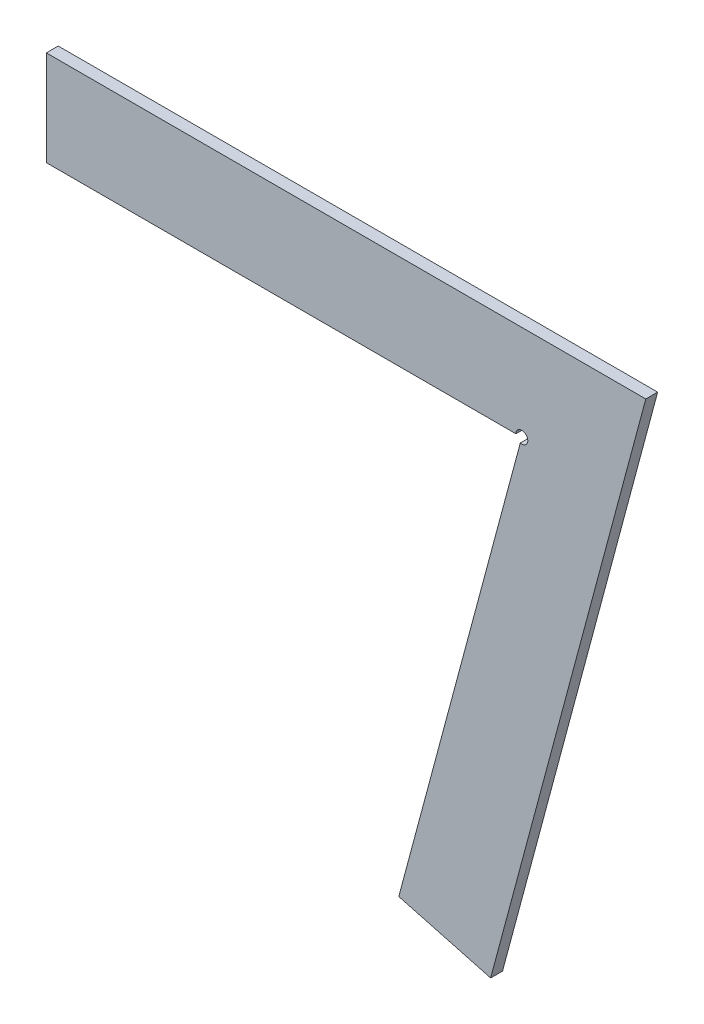
ISO-10303-21;
HEADER;
FILE_DESCRIPTION(('STEP AP214'),'2;1');
FILE_NAME('part.step','',(''),(''),'','','');
FILE_SCHEMA(('AUTOMOTIVE_DESIGN { 1 0 10303 214 1 1 1 1 }'));
ENDSEC;
DATA;
#1=APPLICATION_CONTEXT('core data for automotive mechanical design processes');
#2=APPLICATION_PROTOCOL_DEFINITION('international standard','automotive_design',2000,#1);
#3=PRODUCT_CONTEXT('',#1,'mechanical');
#4=PRODUCT('Part','Part','',(#3));
#5=PRODUCT_RELATED_PRODUCT_CATEGORY('part','',(#4));
#6=PRODUCT_DEFINITION_FORMATION('','',#4);
#7=PRODUCT_DEFINITION_CONTEXT('part definition',#1,'design');
#8=PRODUCT_DEFINITION('design','',#6,#7);
#9=PRODUCT_DEFINITION_SHAPE('','',#8);
#10=(LENGTH_UNIT() NAMED_UNIT(*) SI_UNIT(.MILLI.,.METRE.));
#11=(NAMED_UNIT(*) PLANE_ANGLE_UNIT() SI_UNIT($,.RADIAN.));
#12=(NAMED_UNIT(*) SI_UNIT($,.STERADIAN.) SOLID_ANGLE_UNIT());
#13=UNCERTAINTY_MEASURE_WITH_UNIT(LENGTH_MEASURE(1.E-05),#10,'distance_accuracy_value','');
#14=(GEOMETRIC_REPRESENTATION_CONTEXT(3) GLOBAL_UNCERTAINTY_ASSIGNED_CONTEXT((#13)) GLOBAL_UNIT_ASSIGNED_CONTEXT((#10,
#11,#12)) REPRESENTATION_CONTEXT('',''));
#15=CARTESIAN_POINT('',(0.,0.,0.));
#16=DIRECTION('',(0.,0.,1.));
#17=DIRECTION('',(1.,0.,0.));
#18=AXIS2_PLACEMENT_3D('',#15,#16,#17);
#19=CARTESIAN_POINT('',(252.129014913648,0.,5.));
#20=DIRECTION('',(0.,-1.,0.));
#21=DIRECTION('',(1.,0.,0.));
#22=AXIS2_PLACEMENT_3D('',#19,#20,#21);
#23=PLANE('',#22);
#24=DIRECTION('',(-1.,0.,0.));
#25=VECTOR('',#24,1.);
#26=CARTESIAN_POINT('',(252.129014913648,0.,0.));
#27=LINE('',#26,#25);
#28=CARTESIAN_POINT('',(252.129014913648,0.,0.));
#29=VERTEX_POINT('',#28);
#30=CARTESIAN_POINT('',(0.,0.,0.));
#31=VERTEX_POINT('',#30);
#32=EDGE_CURVE('E123',#29,#31,#27,.T.);
#33=ORIENTED_EDGE('',*,*,#32,.T.);
#34=DIRECTION('',(0.,0.,-1.));
#35=VECTOR('',#34,1.);
#36=CARTESIAN_POINT('',(0.,0.,5.));
#37=LINE('',#36,#35);
#38=CARTESIAN_POINT('',(0.,0.,5.));
#39=VERTEX_POINT('',#38);
#40=EDGE_CURVE('E40',#39,#31,#37,.T.);
#41=ORIENTED_EDGE('',*,*,#40,.F.);
#42=DIRECTION('',(-1.,0.,0.));
#43=VECTOR('',#42,1.);
#44=CARTESIAN_POINT('',(252.129014913648,0.,5.));
#45=LINE('',#44,#43);
#46=CARTESIAN_POINT('',(252.129014913648,0.,5.));
#47=VERTEX_POINT('',#46);
#48=EDGE_CURVE('E135',#47,#39,#45,.T.);
#49=ORIENTED_EDGE('',*,*,#48,.F.);
#50=DIRECTION('',(0.,0.,-1.));
#51=VECTOR('',#50,1.);
#52=CARTESIAN_POINT('',(252.129014913648,0.,5.));
#53=LINE('',#52,#51);
#54=EDGE_CURVE('E119',#47,#29,#53,.T.);
#55=ORIENTED_EDGE('',*,*,#54,.T.);
#56=EDGE_LOOP('',(#33,#41,#49,#55));
#57=FACE_BOUND('',#56,.T.);
#58=ADVANCED_FACE('F33',(#57),#23,.F.);
#59=CARTESIAN_POINT('',(0.,0.,5.));
#60=DIRECTION('',(1.,0.,0.));
#61=DIRECTION('',(0.,1.,0.));
#62=AXIS2_PLACEMENT_3D('',#59,#60,#61);
#63=PLANE('',#62);
#64=DIRECTION('',(0.,-1.,0.));
#65=VECTOR('',#64,1.);
#66=CARTESIAN_POINT('',(0.,0.,0.));
#67=LINE('',#66,#65);
#68=CARTESIAN_POINT('',(0.,-40.,0.));
#69=VERTEX_POINT('',#68);
#70=EDGE_CURVE('E126',#31,#69,#67,.T.);
#71=ORIENTED_EDGE('',*,*,#70,.T.);
#72=DIRECTION('',(0.,0.,-1.));
#73=VECTOR('',#72,1.);
#74=CARTESIAN_POINT('',(0.,-40.,5.));
#75=LINE('',#74,#73);
#76=CARTESIAN_POINT('',(0.,-40.,5.));
#77=VERTEX_POINT('',#76);
#78=EDGE_CURVE('E114',#77,#69,#75,.T.);
#79=ORIENTED_EDGE('',*,*,#78,.F.);
#80=DIRECTION('',(0.,-1.,0.));
#81=VECTOR('',#80,1.);
#82=CARTESIAN_POINT('',(0.,0.,5.));
#83=LINE('',#82,#81);
#84=EDGE_CURVE('E88',#39,#77,#83,.T.);
#85=ORIENTED_EDGE('',*,*,#84,.F.);
#86=ORIENTED_EDGE('',*,*,#40,.T.);
#87=EDGE_LOOP('',(#71,#79,#85,#86));
#88=FACE_BOUND('',#87,.T.);
#89=ADVANCED_FACE('F140',(#88),#63,.F.);
#90=CARTESIAN_POINT('',(0.,-40.,5.));
#91=DIRECTION('',(0.,1.,0.));
#92=DIRECTION('',(-1.,0.,0.));
#93=AXIS2_PLACEMENT_3D('',#90,#91,#92);
#94=PLANE('',#93);
#95=DIRECTION('',(1.,0.,0.));
#96=VECTOR('',#95,1.);
#97=CARTESIAN_POINT('',(0.,-40.,0.));
#98=LINE('',#97,#96);
#99=CARTESIAN_POINT('',(197.5,-40.,0.));
#100=VERTEX_POINT('',#99);
#101=EDGE_CURVE('E128',#69,#100,#98,.T.);
#102=ORIENTED_EDGE('',*,*,#101,.T.);
#103=DIRECTION('',(0.,0.,1.));
#104=VECTOR('',#103,1.);
#105=CARTESIAN_POINT('',(197.5,-40.,0.));
#106=LINE('',#105,#104);
#107=CARTESIAN_POINT('',(197.5,-40.,5.));
#108=VERTEX_POINT('',#107);
#109=EDGE_CURVE('E47',#100,#108,#106,.T.);
#110=ORIENTED_EDGE('',*,*,#109,.T.);
#111=DIRECTION('',(1.,0.,0.));
#112=VECTOR('',#111,1.);
#113=CARTESIAN_POINT('',(0.,-40.,5.));
#114=LINE('',#113,#112);
#115=EDGE_CURVE('E105',#77,#108,#114,.T.);
#116=ORIENTED_EDGE('',*,*,#115,.F.);
#117=ORIENTED_EDGE('',*,*,#78,.T.);
#118=EDGE_LOOP('',(#102,#110,#116,#117));
#119=FACE_BOUND('',#118,.T.);
#120=ADVANCED_FACE('F148',(#119),#94,.F.);
#121=CARTESIAN_POINT('',(200.,-40.,5.));
#122=DIRECTION('',(0.965925826289067,-0.258819045102525,0.));
#123=DIRECTION('',(0.258819045102525,0.965925826289067,0.));
#124=AXIS2_PLACEMENT_3D('',#121,#122,#123);
#125=PLANE('',#124);
#126=DIRECTION('',(-0.258819045102524,-0.965925826289067,0.));
#127=VECTOR('',#126,1.);
#128=CARTESIAN_POINT('',(200.,-40.,5.));
#129=LINE('',#128,#127);
#130=CARTESIAN_POINT('',(199.352952387244,-42.4148145657226,5.));
#131=VERTEX_POINT('',#130);
#132=CARTESIAN_POINT('',(148.236190979495,-233.185165257813,5.));
#133=VERTEX_POINT('',#132);
#134=EDGE_CURVE('E95',#131,#133,#129,.T.);
#135=ORIENTED_EDGE('',*,*,#134,.F.);
#136=DIRECTION('',(0.,0.,1.));
#137=VECTOR('',#136,1.);
#138=CARTESIAN_POINT('',(199.352952387244,-42.4148145657226,0.));
#139=LINE('',#138,#137);
#140=CARTESIAN_POINT('',(199.352952387244,-42.4148145657226,0.));
#141=VERTEX_POINT('',#140);
#142=EDGE_CURVE('E155',#131,#141,#139,.F.);
#143=ORIENTED_EDGE('',*,*,#142,.T.);
#144=DIRECTION('',(-0.258819045102524,-0.965925826289067,0.));
#145=VECTOR('',#144,1.);
#146=CARTESIAN_POINT('',(200.,-40.,0.));
#147=LINE('',#146,#145);
#148=CARTESIAN_POINT('',(148.236190979495,-233.185165257813,0.));
#149=VERTEX_POINT('',#148);
#150=EDGE_CURVE('E111',#141,#149,#147,.T.);
#151=ORIENTED_EDGE('',*,*,#150,.T.);
#152=DIRECTION('',(0.,0.,-1.));
#153=VECTOR('',#152,1.);
#154=CARTESIAN_POINT('',(148.236190979495,-233.185165257813,5.));
#155=LINE('',#154,#153);
#156=EDGE_CURVE('E108',#133,#149,#155,.T.);
#157=ORIENTED_EDGE('',*,*,#156,.F.);
#158=EDGE_LOOP('',(#135,#143,#151,#157));
#159=FACE_BOUND('',#158,.T.);
#160=ADVANCED_FACE('F109',(#159),#125,.F.);
#161=CARTESIAN_POINT('',(148.236190979495,-233.185165257813,5.));
#162=DIRECTION('',(0.258819045102525,0.965925826289067,0.));
#163=DIRECTION('',(-0.965925826289067,0.258819045102525,0.));
#164=AXIS2_PLACEMENT_3D('',#161,#162,#163);
#165=PLANE('',#164);
#166=DIRECTION('',(0.965925826289067,-0.258819045102525,0.));
#167=VECTOR('',#166,1.);
#168=CARTESIAN_POINT('',(148.236190979495,-233.185165257813,0.));
#169=LINE('',#168,#167);
#170=CARTESIAN_POINT('',(186.873224031058,-243.537927061914,0.));
#171=VERTEX_POINT('',#170);
#172=EDGE_CURVE('E132',#149,#171,#169,.T.);
#173=ORIENTED_EDGE('',*,*,#172,.T.);
#174=DIRECTION('',(0.,0.,-1.));
#175=VECTOR('',#174,1.);
#176=CARTESIAN_POINT('',(186.873224031058,-243.537927061914,5.));
#177=LINE('',#176,#175);
#178=CARTESIAN_POINT('',(186.873224031058,-243.537927061914,5.));
#179=VERTEX_POINT('',#178);
#180=EDGE_CURVE('E115',#179,#171,#177,.T.);
#181=ORIENTED_EDGE('',*,*,#180,.F.);
#182=DIRECTION('',(0.965925826289067,-0.258819045102525,0.));
#183=VECTOR('',#182,1.);
#184=CARTESIAN_POINT('',(148.236190979495,-233.185165257813,5.));
#185=LINE('',#184,#183);
#186=EDGE_CURVE('E99',#133,#179,#185,.T.);
#187=ORIENTED_EDGE('',*,*,#186,.F.);
#188=ORIENTED_EDGE('',*,*,#156,.T.);
#189=EDGE_LOOP('',(#173,#181,#187,#188));
#190=FACE_BOUND('',#189,.T.);
#191=ADVANCED_FACE('F117',(#190),#165,.F.);
#192=CARTESIAN_POINT('',(186.873224031058,-243.537927061914,5.));
#193=DIRECTION('',(-0.965925826289067,0.258819045102525,0.));
#194=DIRECTION('',(-0.258819045102525,-0.965925826289067,0.));
#195=AXIS2_PLACEMENT_3D('',#192,#193,#194);
#196=PLANE('',#195);
#197=DIRECTION('',(0.258819045102525,0.965925826289067,0.));
#198=VECTOR('',#197,1.);
#199=CARTESIAN_POINT('',(186.873224031058,-243.537927061914,0.));
#200=LINE('',#199,#198);
#201=EDGE_CURVE('E79',#171,#29,#200,.T.);
#202=ORIENTED_EDGE('',*,*,#201,.T.);
#203=ORIENTED_EDGE('',*,*,#54,.F.);
#204=DIRECTION('',(0.258819045102525,0.965925826289067,0.));
#205=VECTOR('',#204,1.);
#206=CARTESIAN_POINT('',(186.873224031058,-243.537927061914,5.));
#207=LINE('',#206,#205);
#208=EDGE_CURVE('E55',#179,#47,#207,.T.);
#209=ORIENTED_EDGE('',*,*,#208,.F.);
#210=ORIENTED_EDGE('',*,*,#180,.T.);
#211=EDGE_LOOP('',(#202,#203,#209,#210));
#212=FACE_BOUND('',#211,.T.);
#213=ADVANCED_FACE('F161',(#212),#196,.F.);
#214=CARTESIAN_POINT('',(0.,0.,5.));
#215=DIRECTION('',(0.,0.,1.));
#216=DIRECTION('',(1.,0.,0.));
#217=AXIS2_PLACEMENT_3D('',#214,#215,#216);
#218=PLANE('',#217);
#219=CARTESIAN_POINT('',(200.,-40.,5.));
#220=DIRECTION('',(0.,0.,1.));
#221=DIRECTION('',(1.,0.,0.));
#222=AXIS2_PLACEMENT_3D('',#219,#220,#221);
#223=CIRCLE('',#222,2.5);
#224=EDGE_CURVE('E102',#131,#108,#223,.T.);
#225=ORIENTED_EDGE('',*,*,#224,.F.);
#226=ORIENTED_EDGE('',*,*,#134,.T.);
#227=ORIENTED_EDGE('',*,*,#186,.T.);
#228=ORIENTED_EDGE('',*,*,#208,.T.);
#229=ORIENTED_EDGE('',*,*,#48,.T.);
#230=ORIENTED_EDGE('',*,*,#84,.T.);
#231=ORIENTED_EDGE('',*,*,#115,.T.);
#232=EDGE_LOOP('',(#225,#226,#227,#228,#229,#230,#231));
#233=FACE_BOUND('',#232,.T.);
#234=ADVANCED_FACE('F97',(#233),#218,.T.);
#235=CARTESIAN_POINT('',(0.,0.,0.));
#236=DIRECTION('',(0.,0.,1.));
#237=DIRECTION('',(1.,0.,0.));
#238=AXIS2_PLACEMENT_3D('',#235,#236,#237);
#239=PLANE('',#238);
#240=ORIENTED_EDGE('',*,*,#150,.F.);
#241=CARTESIAN_POINT('',(200.,-40.,0.));
#242=DIRECTION('',(0.,0.,1.));
#243=DIRECTION('',(1.,0.,0.));
#244=AXIS2_PLACEMENT_3D('',#241,#242,#243);
#245=CIRCLE('',#244,2.5);
#246=EDGE_CURVE('E11',#141,#100,#245,.T.);
#247=ORIENTED_EDGE('',*,*,#246,.T.);
#248=ORIENTED_EDGE('',*,*,#101,.F.);
#249=ORIENTED_EDGE('',*,*,#70,.F.);
#250=ORIENTED_EDGE('',*,*,#32,.F.);
#251=ORIENTED_EDGE('',*,*,#201,.F.);
#252=ORIENTED_EDGE('',*,*,#172,.F.);
#253=EDGE_LOOP('',(#240,#247,#248,#249,#250,#251,#252));
#254=FACE_BOUND('',#253,.T.);
#255=ADVANCED_FACE('F145',(#254),#239,.F.);
#256=CARTESIAN_POINT('',(200.,-40.,0.));
#257=DIRECTION('',(0.,0.,1.));
#258=DIRECTION('',(1.,0.,0.));
#259=AXIS2_PLACEMENT_3D('',#256,#257,#258);
#260=CYLINDRICAL_SURFACE('',#259,2.5);
#261=ORIENTED_EDGE('',*,*,#246,.F.);
#262=ORIENTED_EDGE('',*,*,#142,.F.);
#263=ORIENTED_EDGE('',*,*,#224,.T.);
#264=ORIENTED_EDGE('',*,*,#109,.F.);
#265=EDGE_LOOP('',(#261,#262,#263,#264));
#266=FACE_BOUND('',#265,.T.);
#267=ADVANCED_FACE('F158',(#266),#260,.F.);
#268=CLOSED_SHELL('',(#58,#89,#120,#160,#191,#213,#234,#255,#267));
#269=MANIFOLD_SOLID_BREP('B2',#268);
#270=ADVANCED_BREP_SHAPE_REPRESENTATION('',(#18,#269),#14);
#271=SHAPE_DEFINITION_REPRESENTATION(#9,#270);
ENDSEC;
END-ISO-10303-21;
